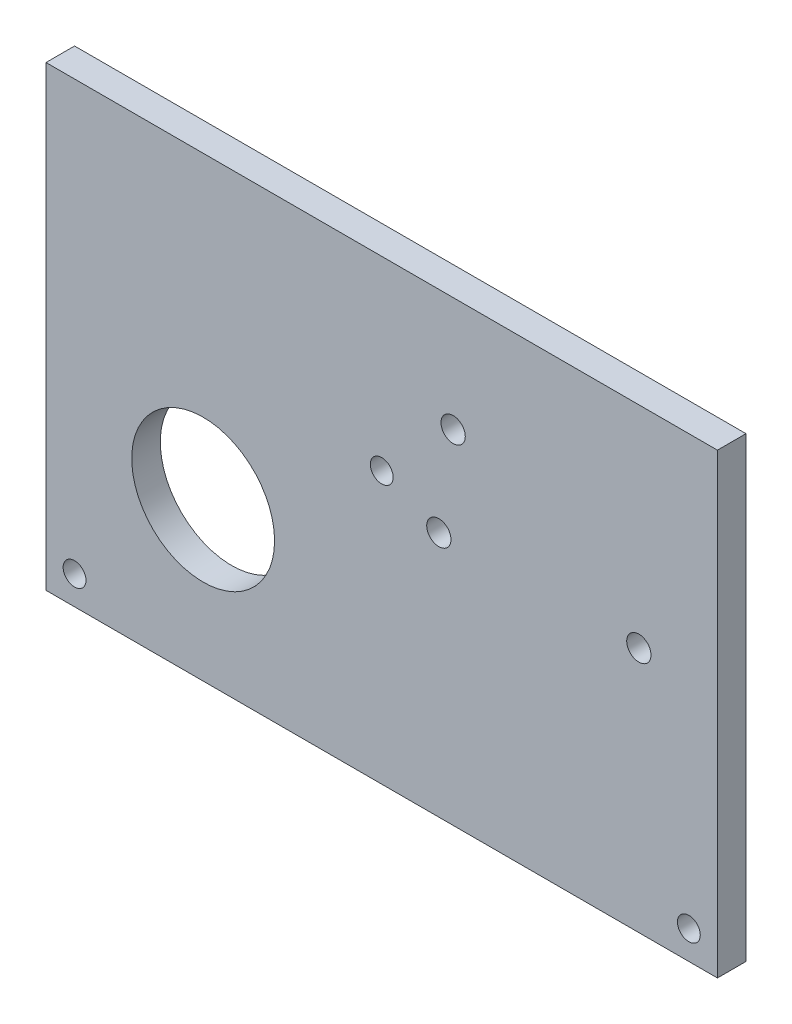
ISO-10303-21;
HEADER;
FILE_DESCRIPTION(('STEP AP214'),'2;1');
FILE_NAME('part.step','',(''),(''),'','','');
FILE_SCHEMA(('AUTOMOTIVE_DESIGN { 1 0 10303 214 1 1 1 1 }'));
ENDSEC;
DATA;
#1=APPLICATION_CONTEXT('core data for automotive mechanical design processes');
#2=APPLICATION_PROTOCOL_DEFINITION('international standard','automotive_design',2000,#1);
#3=PRODUCT_CONTEXT('',#1,'mechanical');
#4=PRODUCT('Part','Part','',(#3));
#5=PRODUCT_RELATED_PRODUCT_CATEGORY('part','',(#4));
#6=PRODUCT_DEFINITION_FORMATION('','',#4);
#7=PRODUCT_DEFINITION_CONTEXT('part definition',#1,'design');
#8=PRODUCT_DEFINITION('design','',#6,#7);
#9=PRODUCT_DEFINITION_SHAPE('','',#8);
#10=(LENGTH_UNIT() NAMED_UNIT(*) SI_UNIT(.MILLI.,.METRE.));
#11=(NAMED_UNIT(*) PLANE_ANGLE_UNIT() SI_UNIT($,.RADIAN.));
#12=(NAMED_UNIT(*) SI_UNIT($,.STERADIAN.) SOLID_ANGLE_UNIT());
#13=UNCERTAINTY_MEASURE_WITH_UNIT(LENGTH_MEASURE(1.E-05),#10,'distance_accuracy_value','');
#14=(GEOMETRIC_REPRESENTATION_CONTEXT(3) GLOBAL_UNCERTAINTY_ASSIGNED_CONTEXT((#13)) GLOBAL_UNIT_ASSIGNED_CONTEXT((#10,
#11,#12)) REPRESENTATION_CONTEXT('',''));
#15=CARTESIAN_POINT('',(0.,0.,0.));
#16=DIRECTION('',(0.,0.,1.));
#17=DIRECTION('',(1.,0.,0.));
#18=AXIS2_PLACEMENT_3D('',#15,#16,#17);
#19=CARTESIAN_POINT('',(0.,0.,2.));
#20=DIRECTION('',(0.,0.,-1.));
#21=DIRECTION('',(-1.,0.,0.));
#22=AXIS2_PLACEMENT_3D('',#19,#20,#21);
#23=PLANE('',#22);
#24=DIRECTION('',(0.,1.,0.));
#25=VECTOR('',#24,1.);
#26=CARTESIAN_POINT('',(2.,70.,2.));
#27=LINE('',#26,#25);
#28=CARTESIAN_POINT('',(2.,70.,2.));
#29=VERTEX_POINT('',#28);
#30=CARTESIAN_POINT('',(2.,134.,2.));
#31=VERTEX_POINT('',#30);
#32=EDGE_CURVE('E99',#29,#31,#27,.T.);
#33=ORIENTED_EDGE('',*,*,#32,.T.);
#34=DIRECTION('',(-1.,0.,0.));
#35=VECTOR('',#34,1.);
#36=CARTESIAN_POINT('',(-92.,134.,2.));
#37=LINE('',#36,#35);
#38=CARTESIAN_POINT('',(-92.,134.,2.));
#39=VERTEX_POINT('',#38);
#40=EDGE_CURVE('E92',#31,#39,#37,.T.);
#41=ORIENTED_EDGE('',*,*,#40,.T.);
#42=DIRECTION('',(0.,-1.,0.));
#43=VECTOR('',#42,1.);
#44=CARTESIAN_POINT('',(-92.,70.,2.));
#45=LINE('',#44,#43);
#46=CARTESIAN_POINT('',(-92.,70.,2.));
#47=VERTEX_POINT('',#46);
#48=EDGE_CURVE('E98',#39,#47,#45,.T.);
#49=ORIENTED_EDGE('',*,*,#48,.T.);
#50=DIRECTION('',(1.,0.,0.));
#51=VECTOR('',#50,1.);
#52=CARTESIAN_POINT('',(-92.,70.,2.));
#53=LINE('',#52,#51);
#54=EDGE_CURVE('E62',#47,#29,#53,.T.);
#55=ORIENTED_EDGE('',*,*,#54,.T.);
#56=EDGE_LOOP('',(#33,#41,#49,#55));
#57=FACE_BOUND('',#56,.T.);
#58=CARTESIAN_POINT('',(-70.,92.,2.));
#59=DIRECTION('',(0.,0.,1.));
#60=DIRECTION('',(1.,0.,0.));
#61=AXIS2_PLACEMENT_3D('',#58,#59,#60);
#62=CIRCLE('',#61,10.);
#63=CARTESIAN_POINT('',(-60.,92.,2.));
#64=VERTEX_POINT('',#63);
#65=EDGE_CURVE('E113',#64,#64,#62,.T.);
#66=ORIENTED_EDGE('',*,*,#65,.F.);
#67=EDGE_LOOP('',(#66));
#68=FACE_BOUND('',#67,.T.);
#69=CARTESIAN_POINT('',(-35.,118.,2.));
#70=DIRECTION('',(0.,0.,1.));
#71=DIRECTION('',(1.,0.,0.));
#72=AXIS2_PLACEMENT_3D('',#69,#70,#71);
#73=CIRCLE('',#72,1.7);
#74=CARTESIAN_POINT('',(-33.3,118.,2.));
#75=VERTEX_POINT('',#74);
#76=EDGE_CURVE('E128',#75,#75,#73,.T.);
#77=ORIENTED_EDGE('',*,*,#76,.F.);
#78=EDGE_LOOP('',(#77));
#79=FACE_BOUND('',#78,.T.);
#80=CARTESIAN_POINT('',(-9.,104.5,2.));
#81=DIRECTION('',(0.,0.,1.));
#82=DIRECTION('',(1.,0.,0.));
#83=AXIS2_PLACEMENT_3D('',#80,#81,#82);
#84=CIRCLE('',#83,1.7);
#85=CARTESIAN_POINT('',(-7.3,104.5,2.));
#86=VERTEX_POINT('',#85);
#87=EDGE_CURVE('E137',#86,#86,#84,.T.);
#88=ORIENTED_EDGE('',*,*,#87,.F.);
#89=EDGE_LOOP('',(#88));
#90=FACE_BOUND('',#89,.T.);
#91=CARTESIAN_POINT('',(-37.,104.5,2.));
#92=DIRECTION('',(0.,0.,1.));
#93=DIRECTION('',(1.,0.,0.));
#94=AXIS2_PLACEMENT_3D('',#91,#92,#93);
#95=CIRCLE('',#94,1.7);
#96=CARTESIAN_POINT('',(-35.3,104.5,2.));
#97=VERTEX_POINT('',#96);
#98=EDGE_CURVE('E142',#97,#97,#95,.T.);
#99=ORIENTED_EDGE('',*,*,#98,.F.);
#100=EDGE_LOOP('',(#99));
#101=FACE_BOUND('',#100,.T.);
#102=CARTESIAN_POINT('',(-88.,74.,2.));
#103=DIRECTION('',(0.,0.,1.));
#104=DIRECTION('',(1.,0.,0.));
#105=AXIS2_PLACEMENT_3D('',#102,#103,#104);
#106=CIRCLE('',#105,1.6);
#107=CARTESIAN_POINT('',(-86.4,74.,2.));
#108=VERTEX_POINT('',#107);
#109=EDGE_CURVE('E146',#108,#108,#106,.T.);
#110=ORIENTED_EDGE('',*,*,#109,.F.);
#111=EDGE_LOOP('',(#110));
#112=FACE_BOUND('',#111,.T.);
#113=CARTESIAN_POINT('',(-2.,74.,2.));
#114=DIRECTION('',(0.,0.,1.));
#115=DIRECTION('',(1.,0.,0.));
#116=AXIS2_PLACEMENT_3D('',#113,#114,#115);
#117=CIRCLE('',#116,1.6);
#118=CARTESIAN_POINT('',(-0.4,74.,2.));
#119=VERTEX_POINT('',#118);
#120=EDGE_CURVE('E152',#119,#119,#117,.T.);
#121=ORIENTED_EDGE('',*,*,#120,.F.);
#122=EDGE_LOOP('',(#121));
#123=FACE_BOUND('',#122,.T.);
#124=CARTESIAN_POINT('',(-45.,108.,2.));
#125=DIRECTION('',(0.,0.,1.));
#126=DIRECTION('',(1.,0.,0.));
#127=AXIS2_PLACEMENT_3D('',#124,#125,#126);
#128=CIRCLE('',#127,1.6);
#129=CARTESIAN_POINT('',(-43.4,108.,2.));
#130=VERTEX_POINT('',#129);
#131=EDGE_CURVE('E159',#130,#130,#128,.T.);
#132=ORIENTED_EDGE('',*,*,#131,.F.);
#133=EDGE_LOOP('',(#132));
#134=FACE_BOUND('',#133,.T.);
#135=ADVANCED_FACE('F50',(#57,#68,#79,#90,#101,#112,#123,#134),#23,.F.);
#136=CARTESIAN_POINT('',(0.,0.,-2.));
#137=DIRECTION('',(0.,0.,-1.));
#138=DIRECTION('',(-1.,0.,0.));
#139=AXIS2_PLACEMENT_3D('',#136,#137,#138);
#140=PLANE('',#139);
#141=CARTESIAN_POINT('',(-2.,74.,-2.));
#142=DIRECTION('',(0.,0.,1.));
#143=DIRECTION('',(1.,0.,0.));
#144=AXIS2_PLACEMENT_3D('',#141,#142,#143);
#145=CIRCLE('',#144,1.6);
#146=CARTESIAN_POINT('',(-0.4,74.,-2.));
#147=VERTEX_POINT('',#146);
#148=EDGE_CURVE('E160',#147,#147,#145,.T.);
#149=ORIENTED_EDGE('',*,*,#148,.T.);
#150=EDGE_LOOP('',(#149));
#151=FACE_BOUND('',#150,.T.);
#152=CARTESIAN_POINT('',(-37.,104.5,-2.));
#153=DIRECTION('',(0.,0.,1.));
#154=DIRECTION('',(1.,0.,0.));
#155=AXIS2_PLACEMENT_3D('',#152,#153,#154);
#156=CIRCLE('',#155,1.7);
#157=CARTESIAN_POINT('',(-35.3,104.5,-2.));
#158=VERTEX_POINT('',#157);
#159=EDGE_CURVE('E144',#158,#158,#156,.T.);
#160=ORIENTED_EDGE('',*,*,#159,.T.);
#161=EDGE_LOOP('',(#160));
#162=FACE_BOUND('',#161,.T.);
#163=CARTESIAN_POINT('',(-35.,118.,-2.));
#164=DIRECTION('',(0.,0.,1.));
#165=DIRECTION('',(1.,0.,0.));
#166=AXIS2_PLACEMENT_3D('',#163,#164,#165);
#167=CIRCLE('',#166,1.7);
#168=CARTESIAN_POINT('',(-33.3,118.,-2.));
#169=VERTEX_POINT('',#168);
#170=EDGE_CURVE('E131',#169,#169,#167,.T.);
#171=ORIENTED_EDGE('',*,*,#170,.T.);
#172=EDGE_LOOP('',(#171));
#173=FACE_BOUND('',#172,.T.);
#174=DIRECTION('',(0.,1.,0.));
#175=VECTOR('',#174,1.);
#176=CARTESIAN_POINT('',(2.,70.,-2.));
#177=LINE('',#176,#175);
#178=CARTESIAN_POINT('',(2.,70.,-2.));
#179=VERTEX_POINT('',#178);
#180=CARTESIAN_POINT('',(2.,134.,-2.));
#181=VERTEX_POINT('',#180);
#182=EDGE_CURVE('E115',#179,#181,#177,.T.);
#183=ORIENTED_EDGE('',*,*,#182,.F.);
#184=DIRECTION('',(1.,0.,0.));
#185=VECTOR('',#184,1.);
#186=CARTESIAN_POINT('',(-92.,70.,-2.));
#187=LINE('',#186,#185);
#188=CARTESIAN_POINT('',(-92.,70.,-2.));
#189=VERTEX_POINT('',#188);
#190=EDGE_CURVE('E86',#189,#179,#187,.T.);
#191=ORIENTED_EDGE('',*,*,#190,.F.);
#192=DIRECTION('',(0.,-1.,0.));
#193=VECTOR('',#192,1.);
#194=CARTESIAN_POINT('',(-92.,70.,-2.));
#195=LINE('',#194,#193);
#196=CARTESIAN_POINT('',(-92.,134.,-2.));
#197=VERTEX_POINT('',#196);
#198=EDGE_CURVE('E85',#197,#189,#195,.T.);
#199=ORIENTED_EDGE('',*,*,#198,.F.);
#200=DIRECTION('',(-1.,0.,0.));
#201=VECTOR('',#200,1.);
#202=CARTESIAN_POINT('',(-92.,134.,-2.));
#203=LINE('',#202,#201);
#204=EDGE_CURVE('E102',#181,#197,#203,.T.);
#205=ORIENTED_EDGE('',*,*,#204,.F.);
#206=EDGE_LOOP('',(#183,#191,#199,#205));
#207=FACE_BOUND('',#206,.T.);
#208=CARTESIAN_POINT('',(-70.,92.,-2.));
#209=DIRECTION('',(0.,0.,1.));
#210=DIRECTION('',(1.,0.,0.));
#211=AXIS2_PLACEMENT_3D('',#208,#209,#210);
#212=CIRCLE('',#211,10.);
#213=CARTESIAN_POINT('',(-60.,92.,-2.));
#214=VERTEX_POINT('',#213);
#215=EDGE_CURVE('E130',#214,#214,#212,.T.);
#216=ORIENTED_EDGE('',*,*,#215,.T.);
#217=EDGE_LOOP('',(#216));
#218=FACE_BOUND('',#217,.T.);
#219=CARTESIAN_POINT('',(-9.,104.5,-2.));
#220=DIRECTION('',(0.,0.,1.));
#221=DIRECTION('',(1.,0.,0.));
#222=AXIS2_PLACEMENT_3D('',#219,#220,#221);
#223=CIRCLE('',#222,1.7);
#224=CARTESIAN_POINT('',(-7.3,104.5,-2.));
#225=VERTEX_POINT('',#224);
#226=EDGE_CURVE('E139',#225,#225,#223,.T.);
#227=ORIENTED_EDGE('',*,*,#226,.T.);
#228=EDGE_LOOP('',(#227));
#229=FACE_BOUND('',#228,.T.);
#230=CARTESIAN_POINT('',(-88.,74.,-2.));
#231=DIRECTION('',(0.,0.,1.));
#232=DIRECTION('',(1.,0.,0.));
#233=AXIS2_PLACEMENT_3D('',#230,#231,#232);
#234=CIRCLE('',#233,1.6);
#235=CARTESIAN_POINT('',(-86.4,74.,-2.));
#236=VERTEX_POINT('',#235);
#237=EDGE_CURVE('E151',#236,#236,#234,.T.);
#238=ORIENTED_EDGE('',*,*,#237,.T.);
#239=EDGE_LOOP('',(#238));
#240=FACE_BOUND('',#239,.T.);
#241=CARTESIAN_POINT('',(-45.,108.,-2.));
#242=DIRECTION('',(0.,0.,1.));
#243=DIRECTION('',(1.,0.,0.));
#244=AXIS2_PLACEMENT_3D('',#241,#242,#243);
#245=CIRCLE('',#244,1.6);
#246=CARTESIAN_POINT('',(-43.4,108.,-2.));
#247=VERTEX_POINT('',#246);
#248=EDGE_CURVE('E162',#247,#247,#245,.T.);
#249=ORIENTED_EDGE('',*,*,#248,.T.);
#250=EDGE_LOOP('',(#249));
#251=FACE_BOUND('',#250,.T.);
#252=ADVANCED_FACE('F123',(#151,#162,#173,#207,#218,#229,#240,#251),#140,.T.);
#253=CARTESIAN_POINT('',(2.,70.,2.));
#254=DIRECTION('',(-1.,0.,0.));
#255=DIRECTION('',(0.,0.,1.));
#256=AXIS2_PLACEMENT_3D('',#253,#254,#255);
#257=PLANE('',#256);
#258=ORIENTED_EDGE('',*,*,#182,.T.);
#259=DIRECTION('',(0.,0.,-1.));
#260=VECTOR('',#259,1.);
#261=CARTESIAN_POINT('',(2.,134.,2.));
#262=LINE('',#261,#260);
#263=EDGE_CURVE('E11',#31,#181,#262,.T.);
#264=ORIENTED_EDGE('',*,*,#263,.F.);
#265=ORIENTED_EDGE('',*,*,#32,.F.);
#266=DIRECTION('',(0.,0.,-1.));
#267=VECTOR('',#266,1.);
#268=CARTESIAN_POINT('',(2.,70.,2.));
#269=LINE('',#268,#267);
#270=EDGE_CURVE('E107',#29,#179,#269,.T.);
#271=ORIENTED_EDGE('',*,*,#270,.T.);
#272=EDGE_LOOP('',(#258,#264,#265,#271));
#273=FACE_BOUND('',#272,.T.);
#274=ADVANCED_FACE('F49',(#273),#257,.F.);
#275=CARTESIAN_POINT('',(-92.,134.,2.));
#276=DIRECTION('',(0.,-1.,0.));
#277=DIRECTION('',(0.,0.,-1.));
#278=AXIS2_PLACEMENT_3D('',#275,#276,#277);
#279=PLANE('',#278);
#280=ORIENTED_EDGE('',*,*,#204,.T.);
#281=DIRECTION('',(0.,0.,-1.));
#282=VECTOR('',#281,1.);
#283=CARTESIAN_POINT('',(-92.,134.,2.));
#284=LINE('',#283,#282);
#285=EDGE_CURVE('E60',#39,#197,#284,.T.);
#286=ORIENTED_EDGE('',*,*,#285,.F.);
#287=ORIENTED_EDGE('',*,*,#40,.F.);
#288=ORIENTED_EDGE('',*,*,#263,.T.);
#289=EDGE_LOOP('',(#280,#286,#287,#288));
#290=FACE_BOUND('',#289,.T.);
#291=ADVANCED_FACE('F103',(#290),#279,.F.);
#292=CARTESIAN_POINT('',(-92.,70.,2.));
#293=DIRECTION('',(1.,0.,0.));
#294=DIRECTION('',(0.,0.,-1.));
#295=AXIS2_PLACEMENT_3D('',#292,#293,#294);
#296=PLANE('',#295);
#297=ORIENTED_EDGE('',*,*,#198,.T.);
#298=DIRECTION('',(0.,0.,-1.));
#299=VECTOR('',#298,1.);
#300=CARTESIAN_POINT('',(-92.,70.,2.));
#301=LINE('',#300,#299);
#302=EDGE_CURVE('E104',#47,#189,#301,.T.);
#303=ORIENTED_EDGE('',*,*,#302,.F.);
#304=ORIENTED_EDGE('',*,*,#48,.F.);
#305=ORIENTED_EDGE('',*,*,#285,.T.);
#306=EDGE_LOOP('',(#297,#303,#304,#305));
#307=FACE_BOUND('',#306,.T.);
#308=ADVANCED_FACE('F106',(#307),#296,.F.);
#309=CARTESIAN_POINT('',(-92.,70.,2.));
#310=DIRECTION('',(0.,1.,0.));
#311=DIRECTION('',(0.,0.,1.));
#312=AXIS2_PLACEMENT_3D('',#309,#310,#311);
#313=PLANE('',#312);
#314=ORIENTED_EDGE('',*,*,#190,.T.);
#315=ORIENTED_EDGE('',*,*,#270,.F.);
#316=ORIENTED_EDGE('',*,*,#54,.F.);
#317=ORIENTED_EDGE('',*,*,#302,.T.);
#318=EDGE_LOOP('',(#314,#315,#316,#317));
#319=FACE_BOUND('',#318,.T.);
#320=ADVANCED_FACE('F117',(#319),#313,.F.);
#321=CARTESIAN_POINT('',(-70.,92.,2.));
#322=DIRECTION('',(0.,0.,-1.));
#323=DIRECTION('',(-1.,0.,0.));
#324=AXIS2_PLACEMENT_3D('',#321,#322,#323);
#325=CYLINDRICAL_SURFACE('',#324,10.);
#326=ORIENTED_EDGE('',*,*,#65,.T.);
#327=EDGE_LOOP('',(#326));
#328=FACE_BOUND('',#327,.T.);
#329=ORIENTED_EDGE('',*,*,#215,.F.);
#330=EDGE_LOOP('',(#329));
#331=FACE_BOUND('',#330,.T.);
#332=ADVANCED_FACE('F185',(#328,#331),#325,.F.);
#333=CARTESIAN_POINT('',(-35.,118.,2.));
#334=DIRECTION('',(0.,0.,-1.));
#335=DIRECTION('',(-1.,0.,0.));
#336=AXIS2_PLACEMENT_3D('',#333,#334,#335);
#337=CYLINDRICAL_SURFACE('',#336,1.7);
#338=ORIENTED_EDGE('',*,*,#76,.T.);
#339=EDGE_LOOP('',(#338));
#340=FACE_BOUND('',#339,.T.);
#341=ORIENTED_EDGE('',*,*,#170,.F.);
#342=EDGE_LOOP('',(#341));
#343=FACE_BOUND('',#342,.T.);
#344=ADVANCED_FACE('F237',(#340,#343),#337,.F.);
#345=CARTESIAN_POINT('',(-9.,104.5,2.));
#346=DIRECTION('',(0.,0.,-1.));
#347=DIRECTION('',(-1.,0.,0.));
#348=AXIS2_PLACEMENT_3D('',#345,#346,#347);
#349=CYLINDRICAL_SURFACE('',#348,1.7);
#350=ORIENTED_EDGE('',*,*,#87,.T.);
#351=EDGE_LOOP('',(#350));
#352=FACE_BOUND('',#351,.T.);
#353=ORIENTED_EDGE('',*,*,#226,.F.);
#354=EDGE_LOOP('',(#353));
#355=FACE_BOUND('',#354,.T.);
#356=ADVANCED_FACE('F242',(#352,#355),#349,.F.);
#357=CARTESIAN_POINT('',(-37.,104.5,2.));
#358=DIRECTION('',(0.,0.,-1.));
#359=DIRECTION('',(-1.,0.,0.));
#360=AXIS2_PLACEMENT_3D('',#357,#358,#359);
#361=CYLINDRICAL_SURFACE('',#360,1.7);
#362=ORIENTED_EDGE('',*,*,#98,.T.);
#363=EDGE_LOOP('',(#362));
#364=FACE_BOUND('',#363,.T.);
#365=ORIENTED_EDGE('',*,*,#159,.F.);
#366=EDGE_LOOP('',(#365));
#367=FACE_BOUND('',#366,.T.);
#368=ADVANCED_FACE('F255',(#364,#367),#361,.F.);
#369=CARTESIAN_POINT('',(-88.,74.,2.));
#370=DIRECTION('',(0.,0.,-1.));
#371=DIRECTION('',(-1.,0.,0.));
#372=AXIS2_PLACEMENT_3D('',#369,#370,#371);
#373=CYLINDRICAL_SURFACE('',#372,1.6);
#374=ORIENTED_EDGE('',*,*,#109,.T.);
#375=EDGE_LOOP('',(#374));
#376=FACE_BOUND('',#375,.T.);
#377=ORIENTED_EDGE('',*,*,#237,.F.);
#378=EDGE_LOOP('',(#377));
#379=FACE_BOUND('',#378,.T.);
#380=ADVANCED_FACE('F262',(#376,#379),#373,.F.);
#381=CARTESIAN_POINT('',(-2.,74.,2.));
#382=DIRECTION('',(0.,0.,-1.));
#383=DIRECTION('',(-1.,0.,0.));
#384=AXIS2_PLACEMENT_3D('',#381,#382,#383);
#385=CYLINDRICAL_SURFACE('',#384,1.6);
#386=ORIENTED_EDGE('',*,*,#120,.T.);
#387=EDGE_LOOP('',(#386));
#388=FACE_BOUND('',#387,.T.);
#389=ORIENTED_EDGE('',*,*,#148,.F.);
#390=EDGE_LOOP('',(#389));
#391=FACE_BOUND('',#390,.T.);
#392=ADVANCED_FACE('F273',(#388,#391),#385,.F.);
#393=CARTESIAN_POINT('',(-45.,108.,2.));
#394=DIRECTION('',(0.,0.,-1.));
#395=DIRECTION('',(-1.,0.,0.));
#396=AXIS2_PLACEMENT_3D('',#393,#394,#395);
#397=CYLINDRICAL_SURFACE('',#396,1.6);
#398=ORIENTED_EDGE('',*,*,#131,.T.);
#399=EDGE_LOOP('',(#398));
#400=FACE_BOUND('',#399,.T.);
#401=ORIENTED_EDGE('',*,*,#248,.F.);
#402=EDGE_LOOP('',(#401));
#403=FACE_BOUND('',#402,.T.);
#404=ADVANCED_FACE('F166',(#400,#403),#397,.F.);
#405=CLOSED_SHELL('',(#135,#252,#274,#291,#308,#320,#332,#344,#356,#368,#380,#392,#404));
#406=MANIFOLD_SOLID_BREP('B2',#405);
#407=ADVANCED_BREP_SHAPE_REPRESENTATION('',(#18,#406),#14);
#408=SHAPE_DEFINITION_REPRESENTATION(#9,#407);
ENDSEC;
END-ISO-10303-21;
